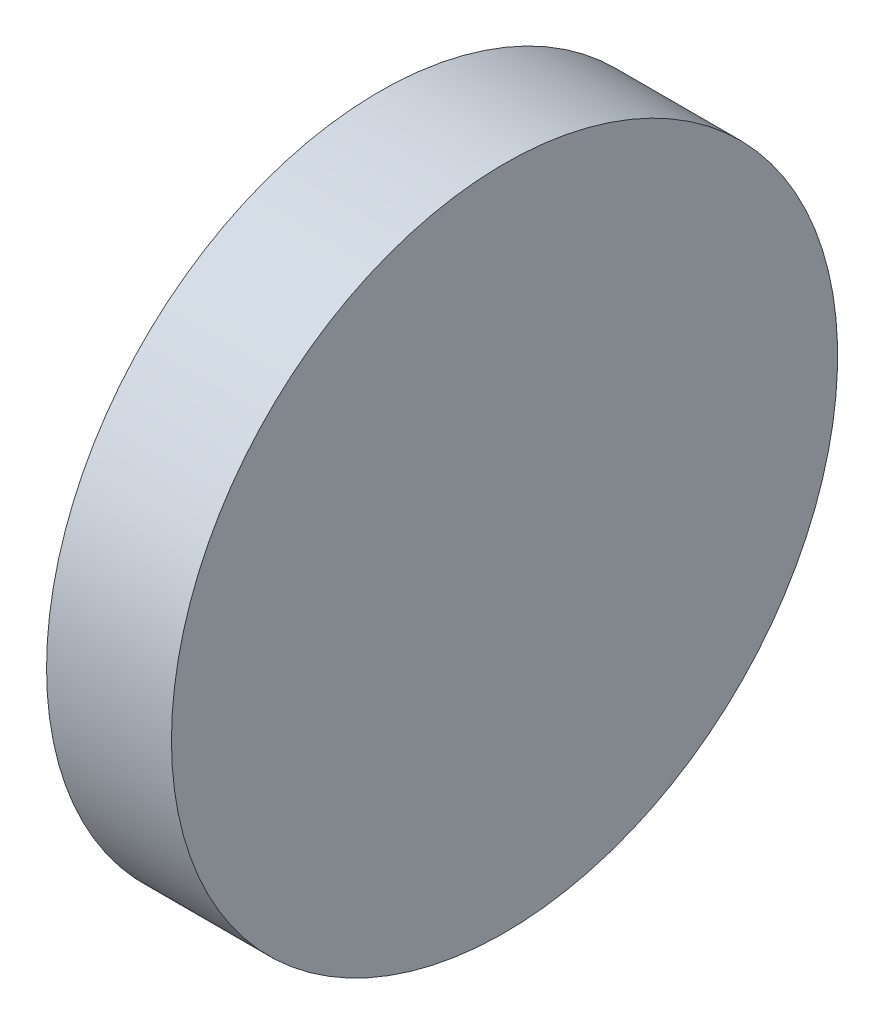
ISO-10303-21;
HEADER;
FILE_DESCRIPTION(('STEP AP214'),'2;1');
FILE_NAME('part.step','',(''),(''),'','','');
FILE_SCHEMA(('AUTOMOTIVE_DESIGN { 1 0 10303 214 1 1 1 1 }'));
ENDSEC;
DATA;
#1=APPLICATION_CONTEXT('core data for automotive mechanical design processes');
#2=APPLICATION_PROTOCOL_DEFINITION('international standard','automotive_design',2000,#1);
#3=PRODUCT_CONTEXT('',#1,'mechanical');
#4=PRODUCT('Part','Part','',(#3));
#5=PRODUCT_RELATED_PRODUCT_CATEGORY('part','',(#4));
#6=PRODUCT_DEFINITION_FORMATION('','',#4);
#7=PRODUCT_DEFINITION_CONTEXT('part definition',#1,'design');
#8=PRODUCT_DEFINITION('design','',#6,#7);
#9=PRODUCT_DEFINITION_SHAPE('','',#8);
#10=(LENGTH_UNIT() NAMED_UNIT(*) SI_UNIT(.MILLI.,.METRE.));
#11=(NAMED_UNIT(*) PLANE_ANGLE_UNIT() SI_UNIT($,.RADIAN.));
#12=(NAMED_UNIT(*) SI_UNIT($,.STERADIAN.) SOLID_ANGLE_UNIT());
#13=UNCERTAINTY_MEASURE_WITH_UNIT(LENGTH_MEASURE(1.E-05),#10,'distance_accuracy_value','');
#14=(GEOMETRIC_REPRESENTATION_CONTEXT(3) GLOBAL_UNCERTAINTY_ASSIGNED_CONTEXT((#13)) GLOBAL_UNIT_ASSIGNED_CONTEXT((#10,
#11,#12)) REPRESENTATION_CONTEXT('',''));
#15=CARTESIAN_POINT('',(0.,0.,0.));
#16=DIRECTION('',(0.,0.,1.));
#17=DIRECTION('',(1.,0.,0.));
#18=AXIS2_PLACEMENT_3D('',#15,#16,#17);
#19=CARTESIAN_POINT('',(4.7625,0.,0.));
#20=DIRECTION('',(-1.,0.,0.));
#21=DIRECTION('',(0.,0.,1.));
#22=AXIS2_PLACEMENT_3D('',#19,#20,#21);
#23=CYLINDRICAL_SURFACE('',#22,12.7);
#24=CARTESIAN_POINT('',(4.7625,0.,0.));
#25=DIRECTION('',(1.,0.,0.));
#26=DIRECTION('',(0.,0.,-1.));
#27=AXIS2_PLACEMENT_3D('',#24,#25,#26);
#28=CIRCLE('',#27,12.7);
#29=CARTESIAN_POINT('',(4.7625,0.,12.7));
#30=VERTEX_POINT('',#29);
#31=EDGE_CURVE('E10',#30,#30,#28,.T.);
#32=CARTESIAN_POINT('',(0.,0.,0.));
#33=DIRECTION('',(1.,0.,0.));
#34=DIRECTION('',(0.,0.,-1.));
#35=AXIS2_PLACEMENT_3D('',#32,#33,#34);
#36=CIRCLE('',#35,12.7);
#37=CARTESIAN_POINT('',(0.,0.,12.7));
#38=VERTEX_POINT('',#37);
#39=EDGE_CURVE('E34',#38,#38,#36,.T.);
#40=CARTESIAN_POINT('',(4.7625,0.,12.7));
#41=CARTESIAN_POINT('',(4.712890625,0.,12.7));
#42=CARTESIAN_POINT('',(4.66328125,0.,12.7));
#43=CARTESIAN_POINT('',(4.5640625,0.,12.7));
#44=CARTESIAN_POINT('',(4.514453125,0.,12.7));
#45=CARTESIAN_POINT('',(4.415234375,0.,12.7));
#46=CARTESIAN_POINT('',(4.365625,0.,12.7));
#47=CARTESIAN_POINT('',(4.26640625,0.,12.7));
#48=CARTESIAN_POINT('',(4.216796875,0.,12.7));
#49=CARTESIAN_POINT('',(4.117578125,0.,12.7));
#50=CARTESIAN_POINT('',(4.06796875,0.,12.7));
#51=CARTESIAN_POINT('',(3.96875,0.,12.7));
#52=CARTESIAN_POINT('',(3.919140625,0.,12.7));
#53=CARTESIAN_POINT('',(3.819921875,0.,12.7));
#54=CARTESIAN_POINT('',(3.7703125,0.,12.7));
#55=CARTESIAN_POINT('',(3.67109375,0.,12.7));
#56=CARTESIAN_POINT('',(3.621484375,0.,12.7));
#57=CARTESIAN_POINT('',(3.522265625,0.,12.7));
#58=CARTESIAN_POINT('',(3.47265625,0.,12.7));
#59=CARTESIAN_POINT('',(3.3734375,0.,12.7));
#60=CARTESIAN_POINT('',(3.323828125,0.,12.7));
#61=CARTESIAN_POINT('',(3.224609375,0.,12.7));
#62=CARTESIAN_POINT('',(3.175,0.,12.7));
#63=CARTESIAN_POINT('',(3.07578125,0.,12.7));
#64=CARTESIAN_POINT('',(3.026171875,0.,12.7));
#65=CARTESIAN_POINT('',(2.926953125,0.,12.7));
#66=CARTESIAN_POINT('',(2.87734375,0.,12.7));
#67=CARTESIAN_POINT('',(2.778125,0.,12.7));
#68=CARTESIAN_POINT('',(2.728515625,0.,12.7));
#69=CARTESIAN_POINT('',(2.629296875,0.,12.7));
#70=CARTESIAN_POINT('',(2.5796875,0.,12.7));
#71=CARTESIAN_POINT('',(2.48046875,0.,12.7));
#72=CARTESIAN_POINT('',(2.430859375,0.,12.7));
#73=CARTESIAN_POINT('',(2.331640625,0.,12.7));
#74=CARTESIAN_POINT('',(2.28203125,0.,12.7));
#75=CARTESIAN_POINT('',(2.1828125,0.,12.7));
#76=CARTESIAN_POINT('',(2.133203125,0.,12.7));
#77=CARTESIAN_POINT('',(2.033984375,0.,12.7));
#78=CARTESIAN_POINT('',(1.984375,0.,12.7));
#79=CARTESIAN_POINT('',(1.88515625,0.,12.7));
#80=CARTESIAN_POINT('',(1.835546875,0.,12.7));
#81=CARTESIAN_POINT('',(1.736328125,0.,12.7));
#82=CARTESIAN_POINT('',(1.68671875,0.,12.7));
#83=CARTESIAN_POINT('',(1.5875,0.,12.7));
#84=CARTESIAN_POINT('',(1.537890625,0.,12.7));
#85=CARTESIAN_POINT('',(1.438671875,0.,12.7));
#86=CARTESIAN_POINT('',(1.3890625,0.,12.7));
#87=CARTESIAN_POINT('',(1.28984375,0.,12.7));
#88=CARTESIAN_POINT('',(1.240234375,0.,12.7));
#89=CARTESIAN_POINT('',(1.141015625,0.,12.7));
#90=CARTESIAN_POINT('',(1.09140625,0.,12.7));
#91=CARTESIAN_POINT('',(0.9921875,0.,12.7));
#92=CARTESIAN_POINT('',(0.942578125,0.,12.7));
#93=CARTESIAN_POINT('',(0.843359375,0.,12.7));
#94=CARTESIAN_POINT('',(0.79375,0.,12.7));
#95=CARTESIAN_POINT('',(0.69453125,0.,12.7));
#96=CARTESIAN_POINT('',(0.644921875,0.,12.7));
#97=CARTESIAN_POINT('',(0.545703125,0.,12.7));
#98=CARTESIAN_POINT('',(0.49609375,0.,12.7));
#99=CARTESIAN_POINT('',(0.396875,0.,12.7));
#100=CARTESIAN_POINT('',(0.347265625,0.,12.7));
#101=CARTESIAN_POINT('',(0.248046875,0.,12.7));
#102=CARTESIAN_POINT('',(0.1984375,0.,12.7));
#103=CARTESIAN_POINT('',(0.09921875,0.,12.7));
#104=CARTESIAN_POINT('',(0.049609375,0.,12.7));
#105=CARTESIAN_POINT('',(0.,0.,12.7));
#106=B_SPLINE_CURVE_WITH_KNOTS('',3,(#40,#41,#42,#43,#44,#45,#46,#47,#48,#49,#50,#51,#52,#53,
#54,#55,#56,#57,#58,#59,#60,#61,#62,#63,#64,#65,#66,#67,#68,#69,#70,#71,#72,#73,#74,#75,#76,#77,
#78,#79,#80,#81,#82,#83,#84,#85,#86,#87,#88,#89,#90,#91,#92,#93,#94,#95,#96,#97,#98,#99,#100,
#101,#102,#103,#104,#105),.UNSPECIFIED.,.F.,.F.,(4,2,2,2,2,2,2,2,2,2,2,2,2,2,2,2,2,2,2,2,2,2,2,
2,2,2,2,2,2,2,2,2,4),(0.,0.148828124999999,0.297656249999999,0.446484374999999,
0.595312499999999,0.744140625,0.89296875,1.041796875,1.190625,1.339453125,1.48828125,
1.637109375,1.7859375,1.934765625,2.08359375,2.232421875,2.38125,2.530078125,2.67890625,
2.827734375,2.9765625,3.125390625,3.27421875,3.423046875,3.571875,3.720703125,3.86953125,
4.018359375,4.1671875,4.316015625,4.46484375,4.613671875,4.7625),.UNSPECIFIED.);
#107=EDGE_CURVE('BSEAM31',#30,#38,#106,.T.);
#108=ORIENTED_EDGE('',*,*,#31,.F.);
#109=ORIENTED_EDGE('',*,*,#39,.T.);
#110=ORIENTED_EDGE('',*,*,#107,.T.);
#111=ORIENTED_EDGE('',*,*,#107,.F.);
#112=EDGE_LOOP('',(#108,#110,#109,#111));
#113=FACE_BOUND('',#112,.T.);
#114=ADVANCED_FACE('F31',(#113),#23,.T.);
#115=CARTESIAN_POINT('',(4.7625,0.,0.));
#116=DIRECTION('',(1.,0.,0.));
#117=DIRECTION('',(0.,0.,-1.));
#118=AXIS2_PLACEMENT_3D('',#115,#116,#117);
#119=PLANE('',#118);
#120=ORIENTED_EDGE('',*,*,#31,.T.);
#121=EDGE_LOOP('',(#120));
#122=FACE_BOUND('',#121,.T.);
#123=ADVANCED_FACE('F46',(#122),#119,.T.);
#124=CARTESIAN_POINT('',(0.,0.,0.));
#125=DIRECTION('',(1.,0.,0.));
#126=DIRECTION('',(0.,0.,-1.));
#127=AXIS2_PLACEMENT_3D('',#124,#125,#126);
#128=PLANE('',#127);
#129=ORIENTED_EDGE('',*,*,#39,.F.);
#130=EDGE_LOOP('',(#129));
#131=FACE_BOUND('',#130,.T.);
#132=ADVANCED_FACE('F44',(#131),#128,.F.);
#133=CLOSED_SHELL('',(#114,#123,#132));
#134=MANIFOLD_SOLID_BREP('B2',#133);
#135=ADVANCED_BREP_SHAPE_REPRESENTATION('',(#18,#134),#14);
#136=SHAPE_DEFINITION_REPRESENTATION(#9,#135);
ENDSEC;
END-ISO-10303-21;
